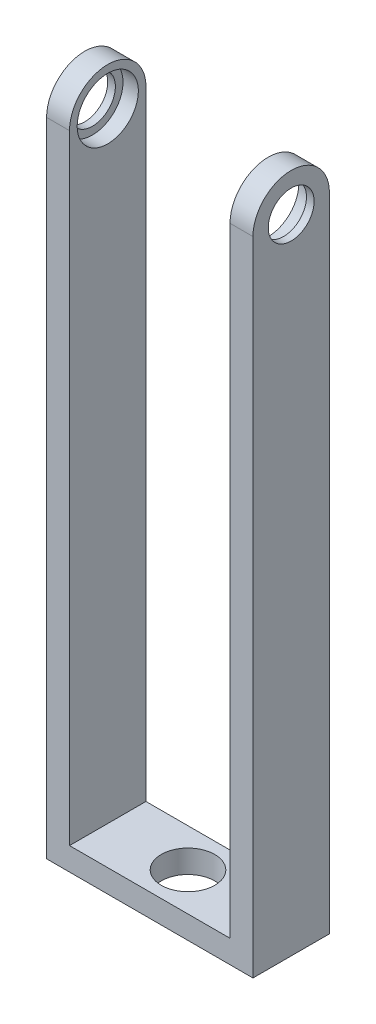
ISO-10303-21;
HEADER;
FILE_DESCRIPTION(('STEP AP214'),'2;1');
FILE_NAME('part.step','',(''),(''),'','','');
FILE_SCHEMA(('AUTOMOTIVE_DESIGN { 1 0 10303 214 1 1 1 1 }'));
ENDSEC;
DATA;
#1=APPLICATION_CONTEXT('core data for automotive mechanical design processes');
#2=APPLICATION_PROTOCOL_DEFINITION('international standard','automotive_design',2000,#1);
#3=PRODUCT_CONTEXT('',#1,'mechanical');
#4=PRODUCT('Part','Part','',(#3));
#5=PRODUCT_RELATED_PRODUCT_CATEGORY('part','',(#4));
#6=PRODUCT_DEFINITION_FORMATION('','',#4);
#7=PRODUCT_DEFINITION_CONTEXT('part definition',#1,'design');
#8=PRODUCT_DEFINITION('design','',#6,#7);
#9=PRODUCT_DEFINITION_SHAPE('','',#8);
#10=(LENGTH_UNIT() NAMED_UNIT(*) SI_UNIT(.MILLI.,.METRE.));
#11=(NAMED_UNIT(*) PLANE_ANGLE_UNIT() SI_UNIT($,.RADIAN.));
#12=(NAMED_UNIT(*) SI_UNIT($,.STERADIAN.) SOLID_ANGLE_UNIT());
#13=UNCERTAINTY_MEASURE_WITH_UNIT(LENGTH_MEASURE(1.E-05),#10,'distance_accuracy_value','');
#14=(GEOMETRIC_REPRESENTATION_CONTEXT(3) GLOBAL_UNCERTAINTY_ASSIGNED_CONTEXT((#13)) GLOBAL_UNIT_ASSIGNED_CONTEXT((#10,
#11,#12)) REPRESENTATION_CONTEXT('',''));
#15=CARTESIAN_POINT('',(0.,0.,0.));
#16=DIRECTION('',(0.,0.,1.));
#17=DIRECTION('',(1.,0.,0.));
#18=AXIS2_PLACEMENT_3D('',#15,#16,#17);
#19=CARTESIAN_POINT('',(-10.5,84.,0.));
#20=DIRECTION('',(-1.,0.,0.));
#21=DIRECTION('',(0.,0.,1.));
#22=AXIS2_PLACEMENT_3D('',#19,#20,#21);
#23=CYLINDRICAL_SURFACE('',#22,3.);
#24=CARTESIAN_POINT('',(-13.5,84.,0.));
#25=DIRECTION('',(1.,0.,0.));
#26=DIRECTION('',(0.,0.,-1.));
#27=AXIS2_PLACEMENT_3D('',#24,#25,#26);
#28=CIRCLE('',#27,3.);
#29=CARTESIAN_POINT('',(-13.5,84.,-3.));
#30=VERTEX_POINT('',#29);
#31=EDGE_CURVE('E135',#30,#30,#28,.T.);
#32=ORIENTED_EDGE('',*,*,#31,.F.);
#33=EDGE_LOOP('',(#32));
#34=FACE_BOUND('',#33,.T.);
#35=CARTESIAN_POINT('',(-12.5,84.,0.));
#36=DIRECTION('',(1.,0.,0.));
#37=DIRECTION('',(0.,0.,-1.));
#38=AXIS2_PLACEMENT_3D('',#35,#36,#37);
#39=CIRCLE('',#38,3.);
#40=CARTESIAN_POINT('',(-12.5,84.,-3.));
#41=VERTEX_POINT('',#40);
#42=EDGE_CURVE('E43',#41,#41,#39,.T.);
#43=ORIENTED_EDGE('',*,*,#42,.T.);
#44=EDGE_LOOP('',(#43));
#45=FACE_BOUND('',#44,.T.);
#46=ADVANCED_FACE('F39',(#34,#45),#23,.F.);
#47=CARTESIAN_POINT('',(10.5,84.,0.));
#48=DIRECTION('',(1.,0.,0.));
#49=DIRECTION('',(0.,0.,-1.));
#50=AXIS2_PLACEMENT_3D('',#47,#48,#49);
#51=CYLINDRICAL_SURFACE('',#50,3.);
#52=CARTESIAN_POINT('',(13.5,84.,0.));
#53=DIRECTION('',(1.,0.,0.));
#54=DIRECTION('',(0.,0.,-1.));
#55=AXIS2_PLACEMENT_3D('',#52,#53,#54);
#56=CIRCLE('',#55,3.);
#57=CARTESIAN_POINT('',(13.5,84.,-3.));
#58=VERTEX_POINT('',#57);
#59=EDGE_CURVE('E155',#58,#58,#56,.T.);
#60=ORIENTED_EDGE('',*,*,#59,.T.);
#61=EDGE_LOOP('',(#60));
#62=FACE_BOUND('',#61,.T.);
#63=CARTESIAN_POINT('',(12.5,84.,0.));
#64=DIRECTION('',(-1.,0.,0.));
#65=DIRECTION('',(0.,0.,1.));
#66=AXIS2_PLACEMENT_3D('',#63,#64,#65);
#67=CIRCLE('',#66,3.);
#68=CARTESIAN_POINT('',(12.5,84.,3.));
#69=VERTEX_POINT('',#68);
#70=EDGE_CURVE('E151',#69,#69,#67,.F.);
#71=ORIENTED_EDGE('',*,*,#70,.F.);
#72=EDGE_LOOP('',(#71));
#73=FACE_BOUND('',#72,.T.);
#74=ADVANCED_FACE('F216',(#62,#73),#51,.F.);
#75=CARTESIAN_POINT('',(13.5,3.,5.));
#76=DIRECTION('',(-1.,0.,0.));
#77=DIRECTION('',(0.,0.,1.));
#78=AXIS2_PLACEMENT_3D('',#75,#76,#77);
#79=PLANE('',#78);
#80=DIRECTION('',(0.,0.,-1.));
#81=VECTOR('',#80,1.);
#82=CARTESIAN_POINT('',(13.5,0.,5.));
#83=LINE('',#82,#81);
#84=CARTESIAN_POINT('',(13.5,0.,5.));
#85=VERTEX_POINT('',#84);
#86=CARTESIAN_POINT('',(13.5,0.,-5.));
#87=VERTEX_POINT('',#86);
#88=EDGE_CURVE('E182',#85,#87,#83,.T.);
#89=ORIENTED_EDGE('',*,*,#88,.T.);
#90=DIRECTION('',(0.,-1.,0.));
#91=VECTOR('',#90,1.);
#92=CARTESIAN_POINT('',(13.5,3.,-5.));
#93=LINE('',#92,#91);
#94=CARTESIAN_POINT('',(13.5,84.,-5.));
#95=VERTEX_POINT('',#94);
#96=EDGE_CURVE('E11',#95,#87,#93,.T.);
#97=ORIENTED_EDGE('',*,*,#96,.F.);
#98=CARTESIAN_POINT('',(13.5,84.,0.));
#99=DIRECTION('',(1.,0.,0.));
#100=DIRECTION('',(0.,0.,1.));
#101=AXIS2_PLACEMENT_3D('',#98,#99,#100);
#102=CIRCLE('',#101,5.);
#103=CARTESIAN_POINT('',(13.5,84.,5.));
#104=VERTEX_POINT('',#103);
#105=EDGE_CURVE('E159',#95,#104,#102,.T.);
#106=ORIENTED_EDGE('',*,*,#105,.T.);
#107=DIRECTION('',(0.,-1.,0.));
#108=VECTOR('',#107,1.);
#109=CARTESIAN_POINT('',(13.5,3.,5.));
#110=LINE('',#109,#108);
#111=EDGE_CURVE('E191',#104,#85,#110,.T.);
#112=ORIENTED_EDGE('',*,*,#111,.T.);
#113=EDGE_LOOP('',(#89,#97,#106,#112));
#114=FACE_BOUND('',#113,.T.);
#115=ORIENTED_EDGE('',*,*,#59,.F.);
#116=EDGE_LOOP('',(#115));
#117=FACE_BOUND('',#116,.T.);
#118=ADVANCED_FACE('F41',(#114,#117),#79,.F.);
#119=CARTESIAN_POINT('',(-13.5,3.,-5.));
#120=DIRECTION('',(0.,0.,1.));
#121=DIRECTION('',(1.,0.,0.));
#122=AXIS2_PLACEMENT_3D('',#119,#120,#121);
#123=PLANE('',#122);
#124=DIRECTION('',(-1.,0.,0.));
#125=VECTOR('',#124,1.);
#126=CARTESIAN_POINT('',(-13.5,3.,-5.));
#127=LINE('',#126,#125);
#128=CARTESIAN_POINT('',(10.5,3.,-5.));
#129=VERTEX_POINT('',#128);
#130=CARTESIAN_POINT('',(-10.5,3.,-5.));
#131=VERTEX_POINT('',#130);
#132=EDGE_CURVE('E57',#129,#131,#127,.T.);
#133=ORIENTED_EDGE('',*,*,#132,.F.);
#134=DIRECTION('',(0.,1.,0.));
#135=VECTOR('',#134,1.);
#136=CARTESIAN_POINT('',(10.5,3.,-5.));
#137=LINE('',#136,#135);
#138=CARTESIAN_POINT('',(10.5,84.,-5.));
#139=VERTEX_POINT('',#138);
#140=EDGE_CURVE('E166',#129,#139,#137,.T.);
#141=ORIENTED_EDGE('',*,*,#140,.T.);
#142=DIRECTION('',(1.,0.,0.));
#143=VECTOR('',#142,1.);
#144=CARTESIAN_POINT('',(10.5,84.,-5.));
#145=LINE('',#144,#143);
#146=EDGE_CURVE('E174',#139,#95,#145,.T.);
#147=ORIENTED_EDGE('',*,*,#146,.T.);
#148=ORIENTED_EDGE('',*,*,#96,.T.);
#149=DIRECTION('',(-1.,0.,0.));
#150=VECTOR('',#149,1.);
#151=CARTESIAN_POINT('',(-13.5,0.,-5.));
#152=LINE('',#151,#150);
#153=CARTESIAN_POINT('',(-13.5,0.,-5.));
#154=VERTEX_POINT('',#153);
#155=EDGE_CURVE('E195',#87,#154,#152,.T.);
#156=ORIENTED_EDGE('',*,*,#155,.T.);
#157=DIRECTION('',(0.,-1.,0.));
#158=VECTOR('',#157,1.);
#159=CARTESIAN_POINT('',(-13.5,3.,-5.));
#160=LINE('',#159,#158);
#161=CARTESIAN_POINT('',(-13.5,84.,-5.));
#162=VERTEX_POINT('',#161);
#163=EDGE_CURVE('E49',#162,#154,#160,.T.);
#164=ORIENTED_EDGE('',*,*,#163,.F.);
#165=DIRECTION('',(-1.,0.,0.));
#166=VECTOR('',#165,1.);
#167=CARTESIAN_POINT('',(-10.5,84.,-5.));
#168=LINE('',#167,#166);
#169=CARTESIAN_POINT('',(-10.5,84.,-5.));
#170=VERTEX_POINT('',#169);
#171=EDGE_CURVE('E126',#170,#162,#168,.T.);
#172=ORIENTED_EDGE('',*,*,#171,.F.);
#173=DIRECTION('',(0.,1.,0.));
#174=VECTOR('',#173,1.);
#175=CARTESIAN_POINT('',(-10.5,3.,-5.));
#176=LINE('',#175,#174);
#177=EDGE_CURVE('E111',#131,#170,#176,.T.);
#178=ORIENTED_EDGE('',*,*,#177,.F.);
#179=EDGE_LOOP('',(#133,#141,#147,#148,#156,#164,#172,#178));
#180=FACE_BOUND('',#179,.T.);
#181=ADVANCED_FACE('F224',(#180),#123,.F.);
#182=CARTESIAN_POINT('',(-13.5,3.,5.));
#183=DIRECTION('',(1.,0.,0.));
#184=DIRECTION('',(0.,0.,-1.));
#185=AXIS2_PLACEMENT_3D('',#182,#183,#184);
#186=PLANE('',#185);
#187=DIRECTION('',(0.,0.,1.));
#188=VECTOR('',#187,1.);
#189=CARTESIAN_POINT('',(-13.5,0.,5.));
#190=LINE('',#189,#188);
#191=CARTESIAN_POINT('',(-13.5,0.,5.));
#192=VERTEX_POINT('',#191);
#193=EDGE_CURVE('E198',#154,#192,#190,.T.);
#194=ORIENTED_EDGE('',*,*,#193,.T.);
#195=DIRECTION('',(0.,-1.,0.));
#196=VECTOR('',#195,1.);
#197=CARTESIAN_POINT('',(-13.5,3.,5.));
#198=LINE('',#197,#196);
#199=CARTESIAN_POINT('',(-13.5,84.,5.));
#200=VERTEX_POINT('',#199);
#201=EDGE_CURVE('E205',#200,#192,#198,.T.);
#202=ORIENTED_EDGE('',*,*,#201,.F.);
#203=CARTESIAN_POINT('',(-13.5,84.,0.));
#204=DIRECTION('',(1.,0.,0.));
#205=DIRECTION('',(0.,0.,1.));
#206=AXIS2_PLACEMENT_3D('',#203,#204,#205);
#207=CIRCLE('',#206,5.);
#208=EDGE_CURVE('E122',#162,#200,#207,.T.);
#209=ORIENTED_EDGE('',*,*,#208,.F.);
#210=ORIENTED_EDGE('',*,*,#163,.T.);
#211=EDGE_LOOP('',(#194,#202,#209,#210));
#212=FACE_BOUND('',#211,.T.);
#213=ORIENTED_EDGE('',*,*,#31,.T.);
#214=EDGE_LOOP('',(#213));
#215=FACE_BOUND('',#214,.T.);
#216=ADVANCED_FACE('F250',(#212,#215),#186,.F.);
#217=CARTESIAN_POINT('',(-13.5,3.,5.));
#218=DIRECTION('',(0.,0.,-1.));
#219=DIRECTION('',(-1.,0.,0.));
#220=AXIS2_PLACEMENT_3D('',#217,#218,#219);
#221=PLANE('',#220);
#222=DIRECTION('',(1.,0.,0.));
#223=VECTOR('',#222,1.);
#224=CARTESIAN_POINT('',(-13.5,0.,5.));
#225=LINE('',#224,#223);
#226=EDGE_CURVE('E188',#192,#85,#225,.T.);
#227=ORIENTED_EDGE('',*,*,#226,.T.);
#228=ORIENTED_EDGE('',*,*,#111,.F.);
#229=DIRECTION('',(1.,0.,0.));
#230=VECTOR('',#229,1.);
#231=CARTESIAN_POINT('',(10.5,84.,5.));
#232=LINE('',#231,#230);
#233=CARTESIAN_POINT('',(10.5,84.,5.));
#234=VERTEX_POINT('',#233);
#235=EDGE_CURVE('E178',#234,#104,#232,.T.);
#236=ORIENTED_EDGE('',*,*,#235,.F.);
#237=DIRECTION('',(0.,-1.,0.));
#238=VECTOR('',#237,1.);
#239=CARTESIAN_POINT('',(10.5,3.,5.));
#240=LINE('',#239,#238);
#241=CARTESIAN_POINT('',(10.5,3.,5.));
#242=VERTEX_POINT('',#241);
#243=EDGE_CURVE('E160',#234,#242,#240,.T.);
#244=ORIENTED_EDGE('',*,*,#243,.T.);
#245=DIRECTION('',(1.,0.,0.));
#246=VECTOR('',#245,1.);
#247=CARTESIAN_POINT('',(-13.5,3.,5.));
#248=LINE('',#247,#246);
#249=CARTESIAN_POINT('',(-10.5,3.,5.));
#250=VERTEX_POINT('',#249);
#251=EDGE_CURVE('E131',#250,#242,#248,.T.);
#252=ORIENTED_EDGE('',*,*,#251,.F.);
#253=DIRECTION('',(0.,-1.,0.));
#254=VECTOR('',#253,1.);
#255=CARTESIAN_POINT('',(-10.5,3.,5.));
#256=LINE('',#255,#254);
#257=CARTESIAN_POINT('',(-10.5,84.,5.));
#258=VERTEX_POINT('',#257);
#259=EDGE_CURVE('E109',#258,#250,#256,.T.);
#260=ORIENTED_EDGE('',*,*,#259,.F.);
#261=DIRECTION('',(-1.,0.,0.));
#262=VECTOR('',#261,1.);
#263=CARTESIAN_POINT('',(-10.5,84.,5.));
#264=LINE('',#263,#262);
#265=EDGE_CURVE('E119',#258,#200,#264,.T.);
#266=ORIENTED_EDGE('',*,*,#265,.T.);
#267=ORIENTED_EDGE('',*,*,#201,.T.);
#268=EDGE_LOOP('',(#227,#228,#236,#244,#252,#260,#266,#267));
#269=FACE_BOUND('',#268,.T.);
#270=ADVANCED_FACE('F129',(#269),#221,.F.);
#271=CARTESIAN_POINT('',(0.,3.,0.));
#272=DIRECTION('',(0.,-1.,0.));
#273=DIRECTION('',(0.,0.,-1.));
#274=AXIS2_PLACEMENT_3D('',#271,#272,#273);
#275=PLANE('',#274);
#276=CARTESIAN_POINT('',(0.,3.,0.));
#277=DIRECTION('',(0.,1.,0.));
#278=DIRECTION('',(0.,0.,1.));
#279=AXIS2_PLACEMENT_3D('',#276,#277,#278);
#280=CIRCLE('',#279,3.5);
#281=CARTESIAN_POINT('',(0.,3.,3.5));
#282=VERTEX_POINT('',#281);
#283=EDGE_CURVE('E288',#282,#282,#280,.T.);
#284=ORIENTED_EDGE('',*,*,#283,.F.);
#285=EDGE_LOOP('',(#284));
#286=FACE_BOUND('',#285,.T.);
#287=ORIENTED_EDGE('',*,*,#132,.T.);
#288=DIRECTION('',(0.,0.,-1.));
#289=VECTOR('',#288,1.);
#290=CARTESIAN_POINT('',(-10.5,3.,5.));
#291=LINE('',#290,#289);
#292=EDGE_CURVE('E61',#250,#131,#291,.T.);
#293=ORIENTED_EDGE('',*,*,#292,.F.);
#294=ORIENTED_EDGE('',*,*,#251,.T.);
#295=DIRECTION('',(0.,0.,-1.));
#296=VECTOR('',#295,1.);
#297=CARTESIAN_POINT('',(10.5,3.,5.));
#298=LINE('',#297,#296);
#299=EDGE_CURVE('E163',#242,#129,#298,.T.);
#300=ORIENTED_EDGE('',*,*,#299,.T.);
#301=EDGE_LOOP('',(#287,#293,#294,#300));
#302=FACE_BOUND('',#301,.T.);
#303=ADVANCED_FACE('F241',(#286,#302),#275,.F.);
#304=CARTESIAN_POINT('',(0.,0.,0.));
#305=DIRECTION('',(0.,-1.,0.));
#306=DIRECTION('',(0.,0.,-1.));
#307=AXIS2_PLACEMENT_3D('',#304,#305,#306);
#308=PLANE('',#307);
#309=CARTESIAN_POINT('',(0.,0.,0.));
#310=DIRECTION('',(0.,1.,0.));
#311=DIRECTION('',(0.,0.,1.));
#312=AXIS2_PLACEMENT_3D('',#309,#310,#311);
#313=CIRCLE('',#312,3.5);
#314=CARTESIAN_POINT('',(0.,0.,3.5));
#315=VERTEX_POINT('',#314);
#316=EDGE_CURVE('E286',#315,#315,#313,.T.);
#317=ORIENTED_EDGE('',*,*,#316,.T.);
#318=EDGE_LOOP('',(#317));
#319=FACE_BOUND('',#318,.T.);
#320=ORIENTED_EDGE('',*,*,#88,.F.);
#321=ORIENTED_EDGE('',*,*,#226,.F.);
#322=ORIENTED_EDGE('',*,*,#193,.F.);
#323=ORIENTED_EDGE('',*,*,#155,.F.);
#324=EDGE_LOOP('',(#320,#321,#322,#323));
#325=FACE_BOUND('',#324,.T.);
#326=ADVANCED_FACE('F239',(#319,#325),#308,.T.);
#327=CARTESIAN_POINT('',(10.5,84.,0.));
#328=DIRECTION('',(1.,0.,0.));
#329=DIRECTION('',(0.,0.,-1.));
#330=AXIS2_PLACEMENT_3D('',#327,#328,#329);
#331=CYLINDRICAL_SURFACE('',#330,5.);
#332=ORIENTED_EDGE('',*,*,#105,.F.);
#333=ORIENTED_EDGE('',*,*,#146,.F.);
#334=CARTESIAN_POINT('',(10.5,84.,0.));
#335=DIRECTION('',(1.,0.,0.));
#336=DIRECTION('',(0.,0.,1.));
#337=AXIS2_PLACEMENT_3D('',#334,#335,#336);
#338=CIRCLE('',#337,5.);
#339=EDGE_CURVE('E170',#139,#234,#338,.T.);
#340=ORIENTED_EDGE('',*,*,#339,.T.);
#341=ORIENTED_EDGE('',*,*,#235,.T.);
#342=EDGE_LOOP('',(#332,#333,#340,#341));
#343=FACE_BOUND('',#342,.T.);
#344=ADVANCED_FACE('F235',(#343),#331,.T.);
#345=CARTESIAN_POINT('',(10.5,84.,0.));
#346=DIRECTION('',(-1.,0.,0.));
#347=DIRECTION('',(0.,0.,1.));
#348=AXIS2_PLACEMENT_3D('',#345,#346,#347);
#349=PLANE('',#348);
#350=CARTESIAN_POINT('',(10.5,84.,0.));
#351=DIRECTION('',(-1.,0.,0.));
#352=DIRECTION('',(0.,0.,1.));
#353=AXIS2_PLACEMENT_3D('',#350,#351,#352);
#354=CIRCLE('',#353,4.);
#355=CARTESIAN_POINT('',(10.5,84.,4.));
#356=VERTEX_POINT('',#355);
#357=EDGE_CURVE('E145',#356,#356,#354,.T.);
#358=ORIENTED_EDGE('',*,*,#357,.F.);
#359=EDGE_LOOP('',(#358));
#360=FACE_BOUND('',#359,.T.);
#361=ORIENTED_EDGE('',*,*,#243,.F.);
#362=ORIENTED_EDGE('',*,*,#339,.F.);
#363=ORIENTED_EDGE('',*,*,#140,.F.);
#364=ORIENTED_EDGE('',*,*,#299,.F.);
#365=EDGE_LOOP('',(#361,#362,#363,#364));
#366=FACE_BOUND('',#365,.T.);
#367=ADVANCED_FACE('F232',(#360,#366),#349,.T.);
#368=CARTESIAN_POINT('',(12.5,84.,0.));
#369=DIRECTION('',(-1.,0.,0.));
#370=DIRECTION('',(0.,0.,1.));
#371=AXIS2_PLACEMENT_3D('',#368,#369,#370);
#372=PLANE('',#371);
#373=CARTESIAN_POINT('',(12.5,84.,0.));
#374=DIRECTION('',(-1.,0.,0.));
#375=DIRECTION('',(0.,0.,1.));
#376=AXIS2_PLACEMENT_3D('',#373,#374,#375);
#377=CIRCLE('',#376,4.);
#378=CARTESIAN_POINT('',(12.5,84.,4.));
#379=VERTEX_POINT('',#378);
#380=EDGE_CURVE('E147',#379,#379,#377,.T.);
#381=ORIENTED_EDGE('',*,*,#380,.T.);
#382=EDGE_LOOP('',(#381));
#383=FACE_BOUND('',#382,.T.);
#384=ORIENTED_EDGE('',*,*,#70,.T.);
#385=EDGE_LOOP('',(#384));
#386=FACE_BOUND('',#385,.T.);
#387=ADVANCED_FACE('F214',(#383,#386),#372,.T.);
#388=CARTESIAN_POINT('',(12.5,84.,0.));
#389=DIRECTION('',(-1.,0.,0.));
#390=DIRECTION('',(0.,0.,1.));
#391=AXIS2_PLACEMENT_3D('',#388,#389,#390);
#392=CYLINDRICAL_SURFACE('',#391,4.);
#393=ORIENTED_EDGE('',*,*,#380,.F.);
#394=EDGE_LOOP('',(#393));
#395=FACE_BOUND('',#394,.T.);
#396=ORIENTED_EDGE('',*,*,#357,.T.);
#397=EDGE_LOOP('',(#396));
#398=FACE_BOUND('',#397,.T.);
#399=ADVANCED_FACE('F230',(#395,#398),#392,.F.);
#400=CARTESIAN_POINT('',(-10.5,84.,0.));
#401=DIRECTION('',(1.,0.,0.));
#402=DIRECTION('',(0.,0.,1.));
#403=AXIS2_PLACEMENT_3D('',#400,#401,#402);
#404=PLANE('',#403);
#405=CARTESIAN_POINT('',(-10.5,84.,0.));
#406=DIRECTION('',(-1.,0.,0.));
#407=DIRECTION('',(0.,0.,1.));
#408=AXIS2_PLACEMENT_3D('',#405,#406,#407);
#409=CIRCLE('',#408,4.);
#410=CARTESIAN_POINT('',(-10.5,84.,4.));
#411=VERTEX_POINT('',#410);
#412=EDGE_CURVE('E280',#411,#411,#409,.T.);
#413=ORIENTED_EDGE('',*,*,#412,.T.);
#414=EDGE_LOOP('',(#413));
#415=FACE_BOUND('',#414,.T.);
#416=ORIENTED_EDGE('',*,*,#259,.T.);
#417=ORIENTED_EDGE('',*,*,#292,.T.);
#418=ORIENTED_EDGE('',*,*,#177,.T.);
#419=CARTESIAN_POINT('',(-10.5,84.,0.));
#420=DIRECTION('',(1.,0.,0.));
#421=DIRECTION('',(0.,0.,1.));
#422=AXIS2_PLACEMENT_3D('',#419,#420,#421);
#423=CIRCLE('',#422,5.);
#424=EDGE_CURVE('E105',#170,#258,#423,.T.);
#425=ORIENTED_EDGE('',*,*,#424,.T.);
#426=EDGE_LOOP('',(#416,#417,#418,#425));
#427=FACE_BOUND('',#426,.T.);
#428=ADVANCED_FACE('F107',(#415,#427),#404,.T.);
#429=CARTESIAN_POINT('',(-10.5,84.,0.));
#430=DIRECTION('',(-1.,0.,0.));
#431=DIRECTION('',(0.,0.,1.));
#432=AXIS2_PLACEMENT_3D('',#429,#430,#431);
#433=CYLINDRICAL_SURFACE('',#432,5.);
#434=ORIENTED_EDGE('',*,*,#208,.T.);
#435=ORIENTED_EDGE('',*,*,#265,.F.);
#436=ORIENTED_EDGE('',*,*,#424,.F.);
#437=ORIENTED_EDGE('',*,*,#171,.T.);
#438=EDGE_LOOP('',(#434,#435,#436,#437));
#439=FACE_BOUND('',#438,.T.);
#440=ADVANCED_FACE('F120',(#439),#433,.T.);
#441=CARTESIAN_POINT('',(-12.5,84.,0.));
#442=DIRECTION('',(1.,0.,0.));
#443=DIRECTION('',(0.,0.,-1.));
#444=AXIS2_PLACEMENT_3D('',#441,#442,#443);
#445=CYLINDRICAL_SURFACE('',#444,4.);
#446=CARTESIAN_POINT('',(-12.5,84.,0.));
#447=DIRECTION('',(-1.,0.,0.));
#448=DIRECTION('',(0.,0.,1.));
#449=AXIS2_PLACEMENT_3D('',#446,#447,#448);
#450=CIRCLE('',#449,4.);
#451=CARTESIAN_POINT('',(-12.5,84.,4.));
#452=VERTEX_POINT('',#451);
#453=EDGE_CURVE('E275',#452,#452,#450,.T.);
#454=ORIENTED_EDGE('',*,*,#453,.T.);
#455=EDGE_LOOP('',(#454));
#456=FACE_BOUND('',#455,.T.);
#457=ORIENTED_EDGE('',*,*,#412,.F.);
#458=EDGE_LOOP('',(#457));
#459=FACE_BOUND('',#458,.T.);
#460=ADVANCED_FACE('F305',(#456,#459),#445,.F.);
#461=CARTESIAN_POINT('',(-12.5,84.,0.));
#462=DIRECTION('',(1.,0.,0.));
#463=DIRECTION('',(0.,0.,1.));
#464=AXIS2_PLACEMENT_3D('',#461,#462,#463);
#465=PLANE('',#464);
#466=ORIENTED_EDGE('',*,*,#42,.F.);
#467=EDGE_LOOP('',(#466));
#468=FACE_BOUND('',#467,.T.);
#469=ORIENTED_EDGE('',*,*,#453,.F.);
#470=EDGE_LOOP('',(#469));
#471=FACE_BOUND('',#470,.T.);
#472=ADVANCED_FACE('F299',(#468,#471),#465,.T.);
#473=CARTESIAN_POINT('',(0.,0.,0.));
#474=DIRECTION('',(0.,1.,0.));
#475=DIRECTION('',(0.,0.,1.));
#476=AXIS2_PLACEMENT_3D('',#473,#474,#475);
#477=CYLINDRICAL_SURFACE('',#476,3.5);
#478=ORIENTED_EDGE('',*,*,#316,.F.);
#479=EDGE_LOOP('',(#478));
#480=FACE_BOUND('',#479,.T.);
#481=ORIENTED_EDGE('',*,*,#283,.T.);
#482=EDGE_LOOP('',(#481));
#483=FACE_BOUND('',#482,.T.);
#484=ADVANCED_FACE('F296',(#480,#483),#477,.F.);
#485=CLOSED_SHELL('',(#46,#74,#118,#181,#216,#270,#303,#326,#344,#367,#387,#399,#428,#440,#460,
#472,#484));
#486=MANIFOLD_SOLID_BREP('B2',#485);
#487=ADVANCED_BREP_SHAPE_REPRESENTATION('',(#18,#486),#14);
#488=SHAPE_DEFINITION_REPRESENTATION(#9,#487);
ENDSEC;
END-ISO-10303-21;
